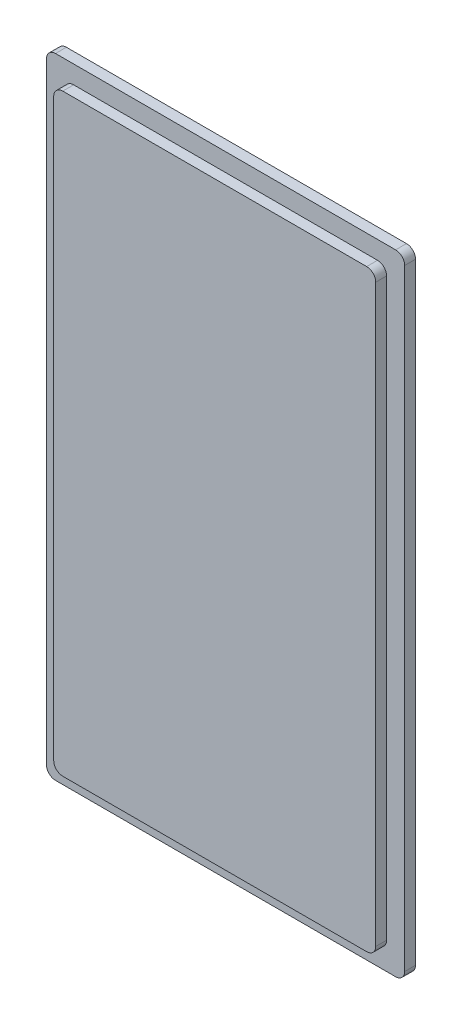
ISO-10303-21;
HEADER;
FILE_DESCRIPTION(('STEP AP214'),'2;1');
FILE_NAME('part.step','',(''),(''),'','','');
FILE_SCHEMA(('AUTOMOTIVE_DESIGN { 1 0 10303 214 1 1 1 1 }'));
ENDSEC;
DATA;
#1=APPLICATION_CONTEXT('core data for automotive mechanical design processes');
#2=APPLICATION_PROTOCOL_DEFINITION('international standard','automotive_design',2000,#1);
#3=PRODUCT_CONTEXT('',#1,'mechanical');
#4=PRODUCT('Part','Part','',(#3));
#5=PRODUCT_RELATED_PRODUCT_CATEGORY('part','',(#4));
#6=PRODUCT_DEFINITION_FORMATION('','',#4);
#7=PRODUCT_DEFINITION_CONTEXT('part definition',#1,'design');
#8=PRODUCT_DEFINITION('design','',#6,#7);
#9=PRODUCT_DEFINITION_SHAPE('','',#8);
#10=(LENGTH_UNIT() NAMED_UNIT(*) SI_UNIT(.MILLI.,.METRE.));
#11=(NAMED_UNIT(*) PLANE_ANGLE_UNIT() SI_UNIT($,.RADIAN.));
#12=(NAMED_UNIT(*) SI_UNIT($,.STERADIAN.) SOLID_ANGLE_UNIT());
#13=UNCERTAINTY_MEASURE_WITH_UNIT(LENGTH_MEASURE(1.E-05),#10,'distance_accuracy_value','');
#14=(GEOMETRIC_REPRESENTATION_CONTEXT(3) GLOBAL_UNCERTAINTY_ASSIGNED_CONTEXT((#13)) GLOBAL_UNIT_ASSIGNED_CONTEXT((#10,
#11,#12)) REPRESENTATION_CONTEXT('',''));
#15=CARTESIAN_POINT('',(0.,0.,0.));
#16=DIRECTION('',(0.,0.,1.));
#17=DIRECTION('',(1.,0.,0.));
#18=AXIS2_PLACEMENT_3D('',#15,#16,#17);
#19=CARTESIAN_POINT('',(-55.3144774068386,-300.986069156775,6.));
#20=DIRECTION('',(0.,0.,-1.));
#21=DIRECTION('',(-1.,0.,0.));
#22=AXIS2_PLACEMENT_3D('',#19,#20,#21);
#23=CYLINDRICAL_SURFACE('',#22,5.);
#24=CARTESIAN_POINT('',(-55.3144774068386,-300.986069156775,0.));
#25=DIRECTION('',(0.,0.,1.));
#26=DIRECTION('',(1.,0.,0.));
#27=AXIS2_PLACEMENT_3D('',#24,#25,#26);
#28=CIRCLE('',#27,5.);
#29=CARTESIAN_POINT('',(-60.3144774068386,-300.986069156775,0.));
#30=VERTEX_POINT('',#29);
#31=CARTESIAN_POINT('',(-55.3144774068386,-305.986069156775,0.));
#32=VERTEX_POINT('',#31);
#33=EDGE_CURVE('E165',#30,#32,#28,.T.);
#34=ORIENTED_EDGE('',*,*,#33,.T.);
#35=DIRECTION('',(0.,0.,-1.));
#36=VECTOR('',#35,1.);
#37=CARTESIAN_POINT('',(-55.3144774068386,-305.986069156775,6.));
#38=LINE('',#37,#36);
#39=CARTESIAN_POINT('',(-55.3144774068386,-305.986069156775,6.));
#40=VERTEX_POINT('',#39);
#41=EDGE_CURVE('E11',#40,#32,#38,.T.);
#42=ORIENTED_EDGE('',*,*,#41,.F.);
#43=CARTESIAN_POINT('',(-55.3144774068386,-300.986069156775,6.));
#44=DIRECTION('',(0.,0.,1.));
#45=DIRECTION('',(1.,0.,0.));
#46=AXIS2_PLACEMENT_3D('',#43,#44,#45);
#47=CIRCLE('',#46,5.);
#48=CARTESIAN_POINT('',(-60.3144774068386,-300.986069156775,6.));
#49=VERTEX_POINT('',#48);
#50=EDGE_CURVE('E174',#49,#40,#47,.T.);
#51=ORIENTED_EDGE('',*,*,#50,.F.);
#52=DIRECTION('',(0.,0.,-1.));
#53=VECTOR('',#52,1.);
#54=CARTESIAN_POINT('',(-60.3144774068386,-300.986069156775,6.));
#55=LINE('',#54,#53);
#56=EDGE_CURVE('E191',#49,#30,#55,.T.);
#57=ORIENTED_EDGE('',*,*,#56,.T.);
#58=EDGE_LOOP('',(#34,#42,#51,#57));
#59=FACE_BOUND('',#58,.T.);
#60=ADVANCED_FACE('F33',(#59),#23,.T.);
#61=CARTESIAN_POINT('',(-55.3144774068386,-305.986069156775,6.));
#62=DIRECTION('',(0.,1.,0.));
#63=DIRECTION('',(0.,0.,1.));
#64=AXIS2_PLACEMENT_3D('',#61,#62,#63);
#65=PLANE('',#64);
#66=DIRECTION('',(1.,0.,0.));
#67=VECTOR('',#66,1.);
#68=CARTESIAN_POINT('',(-55.3144774068386,-305.986069156775,0.));
#69=LINE('',#68,#67);
#70=CARTESIAN_POINT('',(132.685522593161,-305.986069156775,0.));
#71=VERTEX_POINT('',#70);
#72=EDGE_CURVE('E168',#32,#71,#69,.T.);
#73=ORIENTED_EDGE('',*,*,#72,.T.);
#74=DIRECTION('',(0.,0.,-1.));
#75=VECTOR('',#74,1.);
#76=CARTESIAN_POINT('',(132.685522593161,-305.986069156775,6.));
#77=LINE('',#76,#75);
#78=CARTESIAN_POINT('',(132.685522593161,-305.986069156775,6.));
#79=VERTEX_POINT('',#78);
#80=EDGE_CURVE('E40',#79,#71,#77,.T.);
#81=ORIENTED_EDGE('',*,*,#80,.F.);
#82=DIRECTION('',(1.,0.,0.));
#83=VECTOR('',#82,1.);
#84=CARTESIAN_POINT('',(-55.3144774068386,-305.986069156775,6.));
#85=LINE('',#84,#83);
#86=EDGE_CURVE('E177',#40,#79,#85,.T.);
#87=ORIENTED_EDGE('',*,*,#86,.F.);
#88=ORIENTED_EDGE('',*,*,#41,.T.);
#89=EDGE_LOOP('',(#73,#81,#87,#88));
#90=FACE_BOUND('',#89,.T.);
#91=ADVANCED_FACE('F249',(#90),#65,.F.);
#92=CARTESIAN_POINT('',(132.685522593161,-300.986069156775,6.));
#93=DIRECTION('',(0.,0.,-1.));
#94=DIRECTION('',(-1.,0.,0.));
#95=AXIS2_PLACEMENT_3D('',#92,#93,#94);
#96=CYLINDRICAL_SURFACE('',#95,5.);
#97=CARTESIAN_POINT('',(132.685522593161,-300.986069156775,0.));
#98=DIRECTION('',(0.,0.,1.));
#99=DIRECTION('',(1.,0.,0.));
#100=AXIS2_PLACEMENT_3D('',#97,#98,#99);
#101=CIRCLE('',#100,5.);
#102=CARTESIAN_POINT('',(137.685522593161,-300.986069156775,0.));
#103=VERTEX_POINT('',#102);
#104=EDGE_CURVE('E194',#71,#103,#101,.T.);
#105=ORIENTED_EDGE('',*,*,#104,.T.);
#106=DIRECTION('',(0.,0.,-1.));
#107=VECTOR('',#106,1.);
#108=CARTESIAN_POINT('',(137.685522593161,-300.986069156775,6.));
#109=LINE('',#108,#107);
#110=CARTESIAN_POINT('',(137.685522593161,-300.986069156775,6.));
#111=VERTEX_POINT('',#110);
#112=EDGE_CURVE('E219',#111,#103,#109,.T.);
#113=ORIENTED_EDGE('',*,*,#112,.F.);
#114=CARTESIAN_POINT('',(132.685522593161,-300.986069156775,6.));
#115=DIRECTION('',(0.,0.,1.));
#116=DIRECTION('',(1.,0.,0.));
#117=AXIS2_PLACEMENT_3D('',#114,#115,#116);
#118=CIRCLE('',#117,5.);
#119=EDGE_CURVE('E180',#79,#111,#118,.T.);
#120=ORIENTED_EDGE('',*,*,#119,.F.);
#121=ORIENTED_EDGE('',*,*,#80,.T.);
#122=EDGE_LOOP('',(#105,#113,#120,#121));
#123=FACE_BOUND('',#122,.T.);
#124=ADVANCED_FACE('F226',(#123),#96,.T.);
#125=CARTESIAN_POINT('',(137.685522593161,-300.986069156775,6.));
#126=DIRECTION('',(-1.,0.,0.));
#127=DIRECTION('',(0.,0.,1.));
#128=AXIS2_PLACEMENT_3D('',#125,#126,#127);
#129=PLANE('',#128);
#130=DIRECTION('',(0.,1.,0.));
#131=VECTOR('',#130,1.);
#132=CARTESIAN_POINT('',(137.685522593161,-300.986069156775,0.));
#133=LINE('',#132,#131);
#134=CARTESIAN_POINT('',(137.685522593161,37.0139308432251,0.));
#135=VERTEX_POINT('',#134);
#136=EDGE_CURVE('E196',#103,#135,#133,.T.);
#137=ORIENTED_EDGE('',*,*,#136,.T.);
#138=DIRECTION('',(0.,0.,-1.));
#139=VECTOR('',#138,1.);
#140=CARTESIAN_POINT('',(137.685522593161,37.0139308432251,6.));
#141=LINE('',#140,#139);
#142=CARTESIAN_POINT('',(137.685522593161,37.0139308432251,6.));
#143=VERTEX_POINT('',#142);
#144=EDGE_CURVE('E216',#143,#135,#141,.T.);
#145=ORIENTED_EDGE('',*,*,#144,.F.);
#146=DIRECTION('',(0.,1.,0.));
#147=VECTOR('',#146,1.);
#148=CARTESIAN_POINT('',(137.685522593161,-300.986069156775,6.));
#149=LINE('',#148,#147);
#150=EDGE_CURVE('E182',#111,#143,#149,.T.);
#151=ORIENTED_EDGE('',*,*,#150,.F.);
#152=ORIENTED_EDGE('',*,*,#112,.T.);
#153=EDGE_LOOP('',(#137,#145,#151,#152));
#154=FACE_BOUND('',#153,.T.);
#155=ADVANCED_FACE('F237',(#154),#129,.F.);
#156=CARTESIAN_POINT('',(132.685522593161,37.0139308432252,6.));
#157=DIRECTION('',(0.,0.,-1.));
#158=DIRECTION('',(-1.,0.,0.));
#159=AXIS2_PLACEMENT_3D('',#156,#157,#158);
#160=CYLINDRICAL_SURFACE('',#159,5.);
#161=CARTESIAN_POINT('',(132.685522593161,37.0139308432252,0.));
#162=DIRECTION('',(0.,0.,1.));
#163=DIRECTION('',(1.,0.,0.));
#164=AXIS2_PLACEMENT_3D('',#161,#162,#163);
#165=CIRCLE('',#164,5.);
#166=CARTESIAN_POINT('',(132.685522593161,42.0139308432252,0.));
#167=VERTEX_POINT('',#166);
#168=EDGE_CURVE('E198',#135,#167,#165,.T.);
#169=ORIENTED_EDGE('',*,*,#168,.T.);
#170=DIRECTION('',(0.,0.,-1.));
#171=VECTOR('',#170,1.);
#172=CARTESIAN_POINT('',(132.685522593161,42.0139308432252,6.));
#173=LINE('',#172,#171);
#174=CARTESIAN_POINT('',(132.685522593161,42.0139308432252,6.));
#175=VERTEX_POINT('',#174);
#176=EDGE_CURVE('E213',#175,#167,#173,.T.);
#177=ORIENTED_EDGE('',*,*,#176,.F.);
#178=CARTESIAN_POINT('',(132.685522593161,37.0139308432252,6.));
#179=DIRECTION('',(0.,0.,1.));
#180=DIRECTION('',(1.,0.,0.));
#181=AXIS2_PLACEMENT_3D('',#178,#179,#180);
#182=CIRCLE('',#181,5.);
#183=EDGE_CURVE('E184',#143,#175,#182,.T.);
#184=ORIENTED_EDGE('',*,*,#183,.F.);
#185=ORIENTED_EDGE('',*,*,#144,.T.);
#186=EDGE_LOOP('',(#169,#177,#184,#185));
#187=FACE_BOUND('',#186,.T.);
#188=ADVANCED_FACE('F241',(#187),#160,.T.);
#189=CARTESIAN_POINT('',(132.685522593161,42.0139308432252,6.));
#190=DIRECTION('',(0.,-1.,0.));
#191=DIRECTION('',(0.,0.,-1.));
#192=AXIS2_PLACEMENT_3D('',#189,#190,#191);
#193=PLANE('',#192);
#194=DIRECTION('',(-1.,0.,0.));
#195=VECTOR('',#194,1.);
#196=CARTESIAN_POINT('',(132.685522593161,42.0139308432252,0.));
#197=LINE('',#196,#195);
#198=CARTESIAN_POINT('',(-55.3144774068386,42.0139308432252,0.));
#199=VERTEX_POINT('',#198);
#200=EDGE_CURVE('E200',#167,#199,#197,.T.);
#201=ORIENTED_EDGE('',*,*,#200,.T.);
#202=DIRECTION('',(0.,0.,-1.));
#203=VECTOR('',#202,1.);
#204=CARTESIAN_POINT('',(-55.3144774068386,42.0139308432252,6.));
#205=LINE('',#204,#203);
#206=CARTESIAN_POINT('',(-55.3144774068386,42.0139308432252,6.));
#207=VERTEX_POINT('',#206);
#208=EDGE_CURVE('E210',#207,#199,#205,.T.);
#209=ORIENTED_EDGE('',*,*,#208,.F.);
#210=DIRECTION('',(-1.,0.,0.));
#211=VECTOR('',#210,1.);
#212=CARTESIAN_POINT('',(132.685522593161,42.0139308432252,6.));
#213=LINE('',#212,#211);
#214=EDGE_CURVE('E186',#175,#207,#213,.T.);
#215=ORIENTED_EDGE('',*,*,#214,.F.);
#216=ORIENTED_EDGE('',*,*,#176,.T.);
#217=EDGE_LOOP('',(#201,#209,#215,#216));
#218=FACE_BOUND('',#217,.T.);
#219=ADVANCED_FACE('F262',(#218),#193,.F.);
#220=CARTESIAN_POINT('',(-55.3144774068386,37.0139308432252,6.));
#221=DIRECTION('',(0.,0.,-1.));
#222=DIRECTION('',(-1.,0.,0.));
#223=AXIS2_PLACEMENT_3D('',#220,#221,#222);
#224=CYLINDRICAL_SURFACE('',#223,5.);
#225=CARTESIAN_POINT('',(-55.3144774068386,37.0139308432252,0.));
#226=DIRECTION('',(0.,0.,1.));
#227=DIRECTION('',(-1.,0.,0.));
#228=AXIS2_PLACEMENT_3D('',#225,#226,#227);
#229=CIRCLE('',#228,5.);
#230=CARTESIAN_POINT('',(-60.3144774068386,37.0139308432251,0.));
#231=VERTEX_POINT('',#230);
#232=EDGE_CURVE('E202',#199,#231,#229,.T.);
#233=ORIENTED_EDGE('',*,*,#232,.T.);
#234=DIRECTION('',(0.,0.,-1.));
#235=VECTOR('',#234,1.);
#236=CARTESIAN_POINT('',(-60.3144774068386,37.0139308432251,6.));
#237=LINE('',#236,#235);
#238=CARTESIAN_POINT('',(-60.3144774068386,37.0139308432251,6.));
#239=VERTEX_POINT('',#238);
#240=EDGE_CURVE('E207',#239,#231,#237,.T.);
#241=ORIENTED_EDGE('',*,*,#240,.F.);
#242=CARTESIAN_POINT('',(-55.3144774068386,37.0139308432252,6.));
#243=DIRECTION('',(0.,0.,1.));
#244=DIRECTION('',(-1.,0.,0.));
#245=AXIS2_PLACEMENT_3D('',#242,#243,#244);
#246=CIRCLE('',#245,5.);
#247=EDGE_CURVE('E188',#207,#239,#246,.T.);
#248=ORIENTED_EDGE('',*,*,#247,.F.);
#249=ORIENTED_EDGE('',*,*,#208,.T.);
#250=EDGE_LOOP('',(#233,#241,#248,#249));
#251=FACE_BOUND('',#250,.T.);
#252=ADVANCED_FACE('F260',(#251),#224,.T.);
#253=CARTESIAN_POINT('',(-60.3144774068386,37.0139308432251,6.));
#254=DIRECTION('',(1.,0.,0.));
#255=DIRECTION('',(0.,0.,-1.));
#256=AXIS2_PLACEMENT_3D('',#253,#254,#255);
#257=PLANE('',#256);
#258=DIRECTION('',(0.,-1.,0.));
#259=VECTOR('',#258,1.);
#260=CARTESIAN_POINT('',(-60.3144774068386,37.0139308432251,0.));
#261=LINE('',#260,#259);
#262=EDGE_CURVE('E178',#231,#30,#261,.T.);
#263=ORIENTED_EDGE('',*,*,#262,.T.);
#264=ORIENTED_EDGE('',*,*,#56,.F.);
#265=DIRECTION('',(0.,-1.,0.));
#266=VECTOR('',#265,1.);
#267=CARTESIAN_POINT('',(-60.3144774068386,37.0139308432251,6.));
#268=LINE('',#267,#266);
#269=EDGE_CURVE('E190',#239,#49,#268,.T.);
#270=ORIENTED_EDGE('',*,*,#269,.F.);
#271=ORIENTED_EDGE('',*,*,#240,.T.);
#272=EDGE_LOOP('',(#263,#264,#270,#271));
#273=FACE_BOUND('',#272,.T.);
#274=ADVANCED_FACE('F255',(#273),#257,.F.);
#275=CARTESIAN_POINT('',(-55.3144774068386,-300.986069156775,6.));
#276=DIRECTION('',(0.,0.,1.));
#277=DIRECTION('',(1.,0.,0.));
#278=AXIS2_PLACEMENT_3D('',#275,#276,#277);
#279=PLANE('',#278);
#280=CARTESIAN_POINT('',(-45.3144774068386,27.0139308432252,6.));
#281=DIRECTION('',(0.,0.,1.));
#282=DIRECTION('',(-1.,0.,0.));
#283=AXIS2_PLACEMENT_3D('',#280,#281,#282);
#284=CIRCLE('',#283,5.);
#285=CARTESIAN_POINT('',(-45.3144774068386,32.0139308432252,6.));
#286=VERTEX_POINT('',#285);
#287=CARTESIAN_POINT('',(-50.3144774068386,27.0139308432251,6.));
#288=VERTEX_POINT('',#287);
#289=EDGE_CURVE('E47',#286,#288,#284,.T.);
#290=ORIENTED_EDGE('',*,*,#289,.F.);
#291=DIRECTION('',(-1.,0.,0.));
#292=VECTOR('',#291,1.);
#293=CARTESIAN_POINT('',(-45.3144774068386,32.0139308432252,6.));
#294=LINE('',#293,#292);
#295=CARTESIAN_POINT('',(122.685522593161,32.0139308432252,6.));
#296=VERTEX_POINT('',#295);
#297=EDGE_CURVE('E51',#296,#286,#294,.T.);
#298=ORIENTED_EDGE('',*,*,#297,.F.);
#299=CARTESIAN_POINT('',(122.685522593161,27.0139308432252,6.));
#300=DIRECTION('',(0.,0.,1.));
#301=DIRECTION('',(-1.,0.,0.));
#302=AXIS2_PLACEMENT_3D('',#299,#300,#301);
#303=CIRCLE('',#302,5.);
#304=CARTESIAN_POINT('',(127.685522593161,27.0139308432251,6.));
#305=VERTEX_POINT('',#304);
#306=EDGE_CURVE('E415',#305,#296,#303,.T.);
#307=ORIENTED_EDGE('',*,*,#306,.F.);
#308=DIRECTION('',(0.,1.,0.));
#309=VECTOR('',#308,1.);
#310=CARTESIAN_POINT('',(127.685522593161,27.0139308432251,6.));
#311=LINE('',#310,#309);
#312=CARTESIAN_POINT('',(127.685522593161,-290.986069156775,6.));
#313=VERTEX_POINT('',#312);
#314=EDGE_CURVE('E449',#313,#305,#311,.T.);
#315=ORIENTED_EDGE('',*,*,#314,.F.);
#316=CARTESIAN_POINT('',(122.685522593161,-290.986069156775,6.));
#317=DIRECTION('',(0.,0.,1.));
#318=DIRECTION('',(-1.,0.,0.));
#319=AXIS2_PLACEMENT_3D('',#316,#317,#318);
#320=CIRCLE('',#319,5.);
#321=CARTESIAN_POINT('',(122.685522593161,-295.986069156775,6.));
#322=VERTEX_POINT('',#321);
#323=EDGE_CURVE('E442',#322,#313,#320,.T.);
#324=ORIENTED_EDGE('',*,*,#323,.F.);
#325=DIRECTION('',(1.,0.,0.));
#326=VECTOR('',#325,1.);
#327=CARTESIAN_POINT('',(-45.3144774068385,-295.986069156775,6.));
#328=LINE('',#327,#326);
#329=CARTESIAN_POINT('',(-45.3144774068385,-295.986069156775,6.));
#330=VERTEX_POINT('',#329);
#331=EDGE_CURVE('E436',#330,#322,#328,.T.);
#332=ORIENTED_EDGE('',*,*,#331,.F.);
#333=CARTESIAN_POINT('',(-45.3144774068386,-290.986069156775,6.));
#334=DIRECTION('',(0.,0.,1.));
#335=DIRECTION('',(-1.,0.,0.));
#336=AXIS2_PLACEMENT_3D('',#333,#334,#335);
#337=CIRCLE('',#336,5.);
#338=CARTESIAN_POINT('',(-50.3144774068385,-290.986069156775,6.));
#339=VERTEX_POINT('',#338);
#340=EDGE_CURVE('E439',#339,#330,#337,.T.);
#341=ORIENTED_EDGE('',*,*,#340,.F.);
#342=DIRECTION('',(0.,-1.,0.));
#343=VECTOR('',#342,1.);
#344=CARTESIAN_POINT('',(-50.3144774068386,27.0139308432251,6.));
#345=LINE('',#344,#343);
#346=EDGE_CURVE('E440',#288,#339,#345,.T.);
#347=ORIENTED_EDGE('',*,*,#346,.F.);
#348=EDGE_LOOP('',(#290,#298,#307,#315,#324,#332,#341,#347));
#349=FACE_BOUND('',#348,.T.);
#350=ORIENTED_EDGE('',*,*,#50,.T.);
#351=ORIENTED_EDGE('',*,*,#86,.T.);
#352=ORIENTED_EDGE('',*,*,#119,.T.);
#353=ORIENTED_EDGE('',*,*,#150,.T.);
#354=ORIENTED_EDGE('',*,*,#183,.T.);
#355=ORIENTED_EDGE('',*,*,#214,.T.);
#356=ORIENTED_EDGE('',*,*,#247,.T.);
#357=ORIENTED_EDGE('',*,*,#269,.T.);
#358=EDGE_LOOP('',(#350,#351,#352,#353,#354,#355,#356,#357));
#359=FACE_BOUND('',#358,.T.);
#360=ADVANCED_FACE('F245',(#349,#359),#279,.T.);
#361=CARTESIAN_POINT('',(-55.3144774068386,-300.986069156775,0.));
#362=DIRECTION('',(0.,0.,1.));
#363=DIRECTION('',(1.,0.,0.));
#364=AXIS2_PLACEMENT_3D('',#361,#362,#363);
#365=PLANE('',#364);
#366=ORIENTED_EDGE('',*,*,#33,.F.);
#367=ORIENTED_EDGE('',*,*,#262,.F.);
#368=ORIENTED_EDGE('',*,*,#232,.F.);
#369=ORIENTED_EDGE('',*,*,#200,.F.);
#370=ORIENTED_EDGE('',*,*,#168,.F.);
#371=ORIENTED_EDGE('',*,*,#136,.F.);
#372=ORIENTED_EDGE('',*,*,#104,.F.);
#373=ORIENTED_EDGE('',*,*,#72,.F.);
#374=EDGE_LOOP('',(#366,#367,#368,#369,#370,#371,#372,#373));
#375=FACE_BOUND('',#374,.T.);
#376=ADVANCED_FACE('F232',(#375),#365,.F.);
#377=CARTESIAN_POINT('',(-45.3144774068386,27.0139308432252,12.));
#378=DIRECTION('',(0.,0.,-1.));
#379=DIRECTION('',(-1.,0.,0.));
#380=AXIS2_PLACEMENT_3D('',#377,#378,#379);
#381=CYLINDRICAL_SURFACE('',#380,5.);
#382=ORIENTED_EDGE('',*,*,#289,.T.);
#383=DIRECTION('',(0.,0.,-1.));
#384=VECTOR('',#383,1.);
#385=CARTESIAN_POINT('',(-50.3144774068386,27.0139308432251,12.));
#386=LINE('',#385,#384);
#387=CARTESIAN_POINT('',(-50.3144774068386,27.0139308432251,12.));
#388=VERTEX_POINT('',#387);
#389=EDGE_CURVE('E148',#388,#288,#386,.T.);
#390=ORIENTED_EDGE('',*,*,#389,.F.);
#391=CARTESIAN_POINT('',(-45.3144774068386,27.0139308432252,12.));
#392=DIRECTION('',(0.,0.,1.));
#393=DIRECTION('',(-1.,0.,0.));
#394=AXIS2_PLACEMENT_3D('',#391,#392,#393);
#395=CIRCLE('',#394,5.);
#396=CARTESIAN_POINT('',(-45.3144774068386,32.0139308432252,12.));
#397=VERTEX_POINT('',#396);
#398=EDGE_CURVE('E154',#397,#388,#395,.T.);
#399=ORIENTED_EDGE('',*,*,#398,.F.);
#400=DIRECTION('',(0.,0.,-1.));
#401=VECTOR('',#400,1.);
#402=CARTESIAN_POINT('',(-45.3144774068386,32.0139308432252,12.));
#403=LINE('',#402,#401);
#404=EDGE_CURVE('E412',#397,#286,#403,.T.);
#405=ORIENTED_EDGE('',*,*,#404,.T.);
#406=EDGE_LOOP('',(#382,#390,#399,#405));
#407=FACE_BOUND('',#406,.T.);
#408=ADVANCED_FACE('F164',(#407),#381,.T.);
#409=CARTESIAN_POINT('',(-50.3144774068386,27.0139308432251,12.));
#410=DIRECTION('',(1.,0.,0.));
#411=DIRECTION('',(0.,1.,0.));
#412=AXIS2_PLACEMENT_3D('',#409,#410,#411);
#413=PLANE('',#412);
#414=ORIENTED_EDGE('',*,*,#346,.T.);
#415=DIRECTION('',(0.,0.,-1.));
#416=VECTOR('',#415,1.);
#417=CARTESIAN_POINT('',(-50.3144774068385,-290.986069156775,12.));
#418=LINE('',#417,#416);
#419=CARTESIAN_POINT('',(-50.3144774068385,-290.986069156775,12.));
#420=VERTEX_POINT('',#419);
#421=EDGE_CURVE('E150',#420,#339,#418,.T.);
#422=ORIENTED_EDGE('',*,*,#421,.F.);
#423=DIRECTION('',(0.,-1.,0.));
#424=VECTOR('',#423,1.);
#425=CARTESIAN_POINT('',(-50.3144774068386,27.0139308432251,12.));
#426=LINE('',#425,#424);
#427=EDGE_CURVE('E143',#388,#420,#426,.T.);
#428=ORIENTED_EDGE('',*,*,#427,.F.);
#429=ORIENTED_EDGE('',*,*,#389,.T.);
#430=EDGE_LOOP('',(#414,#422,#428,#429));
#431=FACE_BOUND('',#430,.T.);
#432=ADVANCED_FACE('F146',(#431),#413,.F.);
#433=CARTESIAN_POINT('',(-45.3144774068386,-290.986069156775,12.));
#434=DIRECTION('',(0.,0.,-1.));
#435=DIRECTION('',(-1.,0.,0.));
#436=AXIS2_PLACEMENT_3D('',#433,#434,#435);
#437=CYLINDRICAL_SURFACE('',#436,5.);
#438=ORIENTED_EDGE('',*,*,#340,.T.);
#439=DIRECTION('',(0.,0.,-1.));
#440=VECTOR('',#439,1.);
#441=CARTESIAN_POINT('',(-45.3144774068385,-295.986069156775,12.));
#442=LINE('',#441,#440);
#443=CARTESIAN_POINT('',(-45.3144774068385,-295.986069156775,12.));
#444=VERTEX_POINT('',#443);
#445=EDGE_CURVE('E170',#444,#330,#442,.T.);
#446=ORIENTED_EDGE('',*,*,#445,.F.);
#447=CARTESIAN_POINT('',(-45.3144774068386,-290.986069156775,12.));
#448=DIRECTION('',(0.,0.,1.));
#449=DIRECTION('',(-1.,0.,0.));
#450=AXIS2_PLACEMENT_3D('',#447,#448,#449);
#451=CIRCLE('',#450,5.);
#452=EDGE_CURVE('E153',#420,#444,#451,.T.);
#453=ORIENTED_EDGE('',*,*,#452,.F.);
#454=ORIENTED_EDGE('',*,*,#421,.T.);
#455=EDGE_LOOP('',(#438,#446,#453,#454));
#456=FACE_BOUND('',#455,.T.);
#457=ADVANCED_FACE('F340',(#456),#437,.T.);
#458=CARTESIAN_POINT('',(-45.3144774068385,-295.986069156775,12.));
#459=DIRECTION('',(0.,1.,0.));
#460=DIRECTION('',(0.,0.,1.));
#461=AXIS2_PLACEMENT_3D('',#458,#459,#460);
#462=PLANE('',#461);
#463=ORIENTED_EDGE('',*,*,#331,.T.);
#464=DIRECTION('',(0.,0.,-1.));
#465=VECTOR('',#464,1.);
#466=CARTESIAN_POINT('',(122.685522593161,-295.986069156775,12.));
#467=LINE('',#466,#465);
#468=CARTESIAN_POINT('',(122.685522593161,-295.986069156775,12.));
#469=VERTEX_POINT('',#468);
#470=EDGE_CURVE('E429',#469,#322,#467,.T.);
#471=ORIENTED_EDGE('',*,*,#470,.F.);
#472=DIRECTION('',(1.,0.,0.));
#473=VECTOR('',#472,1.);
#474=CARTESIAN_POINT('',(-45.3144774068385,-295.986069156775,12.));
#475=LINE('',#474,#473);
#476=EDGE_CURVE('E437',#444,#469,#475,.T.);
#477=ORIENTED_EDGE('',*,*,#476,.F.);
#478=ORIENTED_EDGE('',*,*,#445,.T.);
#479=EDGE_LOOP('',(#463,#471,#477,#478));
#480=FACE_BOUND('',#479,.T.);
#481=ADVANCED_FACE('F349',(#480),#462,.F.);
#482=CARTESIAN_POINT('',(122.685522593161,-290.986069156775,12.));
#483=DIRECTION('',(0.,0.,-1.));
#484=DIRECTION('',(-1.,0.,0.));
#485=AXIS2_PLACEMENT_3D('',#482,#483,#484);
#486=CYLINDRICAL_SURFACE('',#485,5.);
#487=ORIENTED_EDGE('',*,*,#323,.T.);
#488=DIRECTION('',(0.,0.,-1.));
#489=VECTOR('',#488,1.);
#490=CARTESIAN_POINT('',(127.685522593161,-290.986069156775,12.));
#491=LINE('',#490,#489);
#492=CARTESIAN_POINT('',(127.685522593161,-290.986069156775,12.));
#493=VERTEX_POINT('',#492);
#494=EDGE_CURVE('E426',#493,#313,#491,.T.);
#495=ORIENTED_EDGE('',*,*,#494,.F.);
#496=CARTESIAN_POINT('',(122.685522593161,-290.986069156775,12.));
#497=DIRECTION('',(0.,0.,1.));
#498=DIRECTION('',(-1.,0.,0.));
#499=AXIS2_PLACEMENT_3D('',#496,#497,#498);
#500=CIRCLE('',#499,5.);
#501=EDGE_CURVE('E457',#469,#493,#500,.T.);
#502=ORIENTED_EDGE('',*,*,#501,.F.);
#503=ORIENTED_EDGE('',*,*,#470,.T.);
#504=EDGE_LOOP('',(#487,#495,#502,#503));
#505=FACE_BOUND('',#504,.T.);
#506=ADVANCED_FACE('F359',(#505),#486,.T.);
#507=CARTESIAN_POINT('',(127.685522593161,27.0139308432251,12.));
#508=DIRECTION('',(-1.,0.,0.));
#509=DIRECTION('',(0.,-1.,0.));
#510=AXIS2_PLACEMENT_3D('',#507,#508,#509);
#511=PLANE('',#510);
#512=ORIENTED_EDGE('',*,*,#314,.T.);
#513=DIRECTION('',(0.,0.,-1.));
#514=VECTOR('',#513,1.);
#515=CARTESIAN_POINT('',(127.685522593161,27.0139308432251,12.));
#516=LINE('',#515,#514);
#517=CARTESIAN_POINT('',(127.685522593161,27.0139308432251,12.));
#518=VERTEX_POINT('',#517);
#519=EDGE_CURVE('E418',#518,#305,#516,.T.);
#520=ORIENTED_EDGE('',*,*,#519,.F.);
#521=DIRECTION('',(0.,1.,0.));
#522=VECTOR('',#521,1.);
#523=CARTESIAN_POINT('',(127.685522593161,27.0139308432251,12.));
#524=LINE('',#523,#522);
#525=EDGE_CURVE('E455',#493,#518,#524,.T.);
#526=ORIENTED_EDGE('',*,*,#525,.F.);
#527=ORIENTED_EDGE('',*,*,#494,.T.);
#528=EDGE_LOOP('',(#512,#520,#526,#527));
#529=FACE_BOUND('',#528,.T.);
#530=ADVANCED_FACE('F369',(#529),#511,.F.);
#531=CARTESIAN_POINT('',(122.685522593161,27.0139308432252,12.));
#532=DIRECTION('',(0.,0.,-1.));
#533=DIRECTION('',(-1.,0.,0.));
#534=AXIS2_PLACEMENT_3D('',#531,#532,#533);
#535=CYLINDRICAL_SURFACE('',#534,5.);
#536=ORIENTED_EDGE('',*,*,#306,.T.);
#537=DIRECTION('',(0.,0.,-1.));
#538=VECTOR('',#537,1.);
#539=CARTESIAN_POINT('',(122.685522593161,32.0139308432252,12.));
#540=LINE('',#539,#538);
#541=CARTESIAN_POINT('',(122.685522593161,32.0139308432252,12.));
#542=VERTEX_POINT('',#541);
#543=EDGE_CURVE('E414',#542,#296,#540,.T.);
#544=ORIENTED_EDGE('',*,*,#543,.F.);
#545=CARTESIAN_POINT('',(122.685522593161,27.0139308432252,12.));
#546=DIRECTION('',(0.,0.,1.));
#547=DIRECTION('',(-1.,0.,0.));
#548=AXIS2_PLACEMENT_3D('',#545,#546,#547);
#549=CIRCLE('',#548,5.);
#550=EDGE_CURVE('E420',#518,#542,#549,.T.);
#551=ORIENTED_EDGE('',*,*,#550,.F.);
#552=ORIENTED_EDGE('',*,*,#519,.T.);
#553=EDGE_LOOP('',(#536,#544,#551,#552));
#554=FACE_BOUND('',#553,.T.);
#555=ADVANCED_FACE('F379',(#554),#535,.T.);
#556=CARTESIAN_POINT('',(-45.3144774068386,32.0139308432252,12.));
#557=DIRECTION('',(0.,-1.,0.));
#558=DIRECTION('',(1.,0.,0.));
#559=AXIS2_PLACEMENT_3D('',#556,#557,#558);
#560=PLANE('',#559);
#561=ORIENTED_EDGE('',*,*,#297,.T.);
#562=ORIENTED_EDGE('',*,*,#404,.F.);
#563=DIRECTION('',(-1.,0.,0.));
#564=VECTOR('',#563,1.);
#565=CARTESIAN_POINT('',(-45.3144774068386,32.0139308432252,12.));
#566=LINE('',#565,#564);
#567=EDGE_CURVE('E159',#542,#397,#566,.T.);
#568=ORIENTED_EDGE('',*,*,#567,.F.);
#569=ORIENTED_EDGE('',*,*,#543,.T.);
#570=EDGE_LOOP('',(#561,#562,#568,#569));
#571=FACE_BOUND('',#570,.T.);
#572=ADVANCED_FACE('F389',(#571),#560,.F.);
#573=CARTESIAN_POINT('',(-45.3144774068386,27.0139308432252,12.));
#574=DIRECTION('',(0.,0.,-1.));
#575=DIRECTION('',(-1.,0.,0.));
#576=AXIS2_PLACEMENT_3D('',#573,#574,#575);
#577=PLANE('',#576);
#578=ORIENTED_EDGE('',*,*,#398,.T.);
#579=ORIENTED_EDGE('',*,*,#427,.T.);
#580=ORIENTED_EDGE('',*,*,#452,.T.);
#581=ORIENTED_EDGE('',*,*,#476,.T.);
#582=ORIENTED_EDGE('',*,*,#501,.T.);
#583=ORIENTED_EDGE('',*,*,#525,.T.);
#584=ORIENTED_EDGE('',*,*,#550,.T.);
#585=ORIENTED_EDGE('',*,*,#567,.T.);
#586=EDGE_LOOP('',(#578,#579,#580,#581,#582,#583,#584,#585));
#587=FACE_BOUND('',#586,.T.);
#588=ADVANCED_FACE('F157',(#587),#577,.F.);
#589=CLOSED_SHELL('',(#60,#91,#124,#155,#188,#219,#252,#274,#360,#376,#408,#432,#457,#481,#506,
#530,#555,#572,#588));
#590=MANIFOLD_SOLID_BREP('B2',#589);
#591=ADVANCED_BREP_SHAPE_REPRESENTATION('',(#18,#590),#14);
#592=SHAPE_DEFINITION_REPRESENTATION(#9,#591);
ENDSEC;
END-ISO-10303-21;
